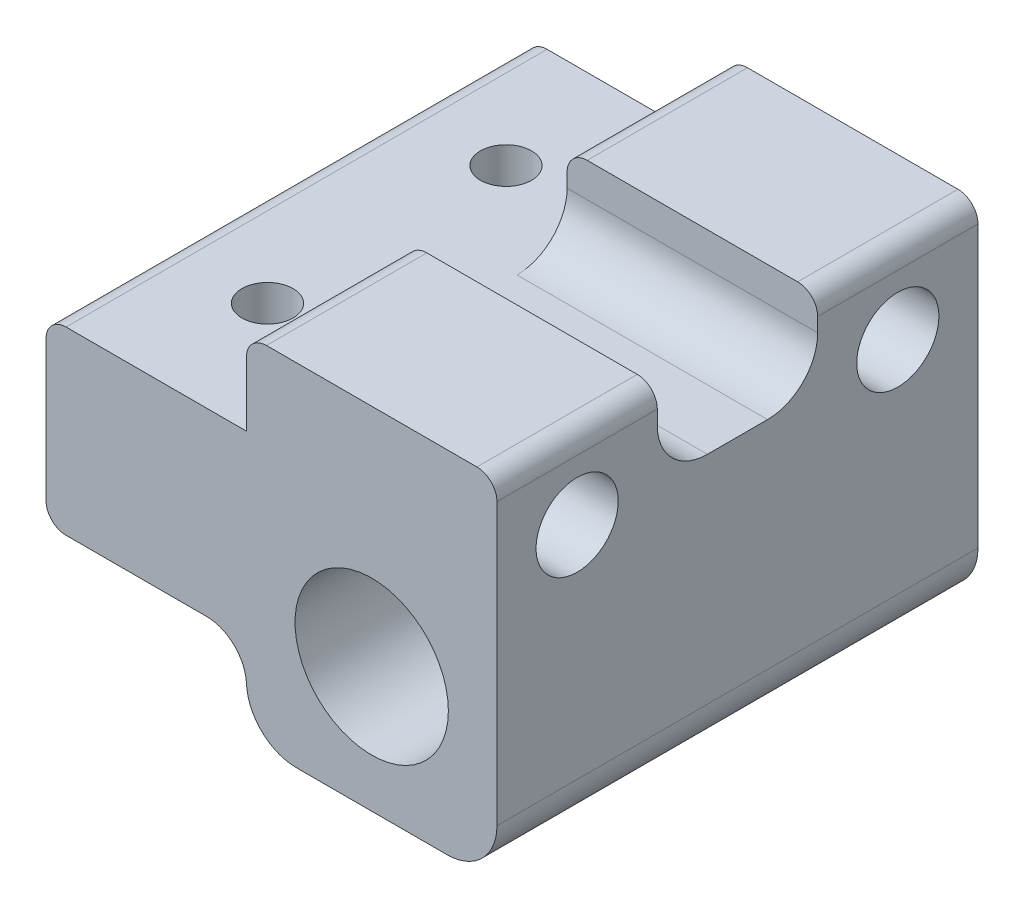
ISO-10303-21;
HEADER;
FILE_DESCRIPTION(('STEP AP214'),'2;1');
FILE_NAME('part.step','',(''),(''),'','','');
FILE_SCHEMA(('AUTOMOTIVE_DESIGN { 1 0 10303 214 1 1 1 1 }'));
ENDSEC;
DATA;
#1=APPLICATION_CONTEXT('core data for automotive mechanical design processes');
#2=APPLICATION_PROTOCOL_DEFINITION('international standard','automotive_design',2000,#1);
#3=PRODUCT_CONTEXT('',#1,'mechanical');
#4=PRODUCT('Part','Part','',(#3));
#5=PRODUCT_RELATED_PRODUCT_CATEGORY('part','',(#4));
#6=PRODUCT_DEFINITION_FORMATION('','',#4);
#7=PRODUCT_DEFINITION_CONTEXT('part definition',#1,'design');
#8=PRODUCT_DEFINITION('design','',#6,#7);
#9=PRODUCT_DEFINITION_SHAPE('','',#8);
#10=(LENGTH_UNIT() NAMED_UNIT(*) SI_UNIT(.MILLI.,.METRE.));
#11=(NAMED_UNIT(*) PLANE_ANGLE_UNIT() SI_UNIT($,.RADIAN.));
#12=(NAMED_UNIT(*) SI_UNIT($,.STERADIAN.) SOLID_ANGLE_UNIT());
#13=UNCERTAINTY_MEASURE_WITH_UNIT(LENGTH_MEASURE(1.E-05),#10,'distance_accuracy_value','');
#14=(GEOMETRIC_REPRESENTATION_CONTEXT(3) GLOBAL_UNCERTAINTY_ASSIGNED_CONTEXT((#13)) GLOBAL_UNIT_ASSIGNED_CONTEXT((#10,
#11,#12)) REPRESENTATION_CONTEXT('',''));
#15=CARTESIAN_POINT('',(0.,0.,0.));
#16=DIRECTION('',(0.,0.,1.));
#17=DIRECTION('',(1.,0.,0.));
#18=AXIS2_PLACEMENT_3D('',#15,#16,#17);
#19=CARTESIAN_POINT('',(-16.4829268292683,25.,-29.6487804878049));
#20=DIRECTION('',(1.,0.,0.));
#21=DIRECTION('',(0.,0.,-1.));
#22=AXIS2_PLACEMENT_3D('',#19,#20,#21);
#23=PLANE('',#22);
#24=DIRECTION('',(0.,-1.,0.));
#25=VECTOR('',#24,1.);
#26=CARTESIAN_POINT('',(-16.4829268292683,25.,18.3512195121952));
#27=LINE('',#26,#25);
#28=CARTESIAN_POINT('',(-16.4829268292683,33.,18.3512195121952));
#29=VERTEX_POINT('',#28);
#30=CARTESIAN_POINT('',(-16.4829268292683,26.5936932147923,18.3512195121952));
#31=VERTEX_POINT('',#30);
#32=EDGE_CURVE('E299',#29,#31,#27,.T.);
#33=ORIENTED_EDGE('',*,*,#32,.F.);
#34=DIRECTION('',(0.,0.,1.));
#35=VECTOR('',#34,1.);
#36=CARTESIAN_POINT('',(-16.4829268292683,33.,2.35121951219515));
#37=LINE('',#36,#35);
#38=CARTESIAN_POINT('',(-16.4829268292683,33.,2.35121951219515));
#39=VERTEX_POINT('',#38);
#40=EDGE_CURVE('E63',#29,#39,#37,.F.);
#41=ORIENTED_EDGE('',*,*,#40,.T.);
#42=DIRECTION('',(0.,1.,0.));
#43=VECTOR('',#42,1.);
#44=CARTESIAN_POINT('',(-16.4829268292683,-3.08795094451934,2.35121951219515));
#45=LINE('',#44,#43);
#46=CARTESIAN_POINT('',(-16.4829268292683,31.5936932147923,2.35121951219515));
#47=VERTEX_POINT('',#46);
#48=EDGE_CURVE('E481',#47,#39,#45,.T.);
#49=ORIENTED_EDGE('',*,*,#48,.F.);
#50=CARTESIAN_POINT('',(-16.4829268292683,31.5936932147923,-2.64878048780485));
#51=DIRECTION('',(1.,0.,0.));
#52=DIRECTION('',(0.,0.,-1.));
#53=AXIS2_PLACEMENT_3D('',#50,#51,#52);
#54=CIRCLE('',#53,5.);
#55=CARTESIAN_POINT('',(-16.4829268292683,26.5936932147923,-2.64878048780485));
#56=VERTEX_POINT('',#55);
#57=EDGE_CURVE('E216',#47,#56,#54,.T.);
#58=ORIENTED_EDGE('',*,*,#57,.T.);
#59=DIRECTION('',(0.,0.,-1.));
#60=VECTOR('',#59,1.);
#61=CARTESIAN_POINT('',(-16.4829268292683,26.5936932147923,18.3512195121952));
#62=LINE('',#61,#60);
#63=CARTESIAN_POINT('',(-16.4829268292683,26.5936932147923,6.27140152651317));
#64=VERTEX_POINT('',#63);
#65=EDGE_CURVE('E214',#64,#56,#62,.T.);
#66=ORIENTED_EDGE('',*,*,#65,.F.);
#67=CARTESIAN_POINT('',(-16.4829268292683,27.,10.3512195121951));
#68=DIRECTION('',(1.,0.,0.));
#69=DIRECTION('',(0.,0.,-1.));
#70=AXIS2_PLACEMENT_3D('',#67,#68,#69);
#71=CIRCLE('',#70,4.1);
#72=CARTESIAN_POINT('',(-16.4829268292683,26.5936932147923,14.4310374978771));
#73=VERTEX_POINT('',#72);
#74=EDGE_CURVE('E202',#64,#73,#71,.T.);
#75=ORIENTED_EDGE('',*,*,#74,.T.);
#76=EDGE_CURVE('E234',#31,#73,#62,.T.);
#77=ORIENTED_EDGE('',*,*,#76,.F.);
#78=EDGE_LOOP('',(#33,#41,#49,#58,#66,#75,#77));
#79=FACE_BOUND('',#78,.T.);
#80=ADVANCED_FACE('F39',(#79),#23,.F.);
#81=CARTESIAN_POINT('',(0.,35.,0.));
#82=DIRECTION('',(0.,1.,0.));
#83=DIRECTION('',(0.,0.,1.));
#84=AXIS2_PLACEMENT_3D('',#81,#82,#83);
#85=PLANE('',#84);
#86=DIRECTION('',(1.,0.,0.));
#87=VECTOR('',#86,1.);
#88=CARTESIAN_POINT('',(-16.4829268292683,35.,2.35121951219515));
#89=LINE('',#88,#87);
#90=CARTESIAN_POINT('',(-14.4829268292683,35.,2.35121951219515));
#91=VERTEX_POINT('',#90);
#92=CARTESIAN_POINT('',(6.51707317073171,35.,2.35121951219515));
#93=VERTEX_POINT('',#92);
#94=EDGE_CURVE('E470',#91,#93,#89,.T.);
#95=ORIENTED_EDGE('',*,*,#94,.F.);
#96=DIRECTION('',(0.,0.,1.));
#97=VECTOR('',#96,1.);
#98=CARTESIAN_POINT('',(-14.4829268292683,35.,18.3512195121952));
#99=LINE('',#98,#97);
#100=CARTESIAN_POINT('',(-14.4829268292683,35.,18.3512195121952));
#101=VERTEX_POINT('',#100);
#102=EDGE_CURVE('E417',#91,#101,#99,.T.);
#103=ORIENTED_EDGE('',*,*,#102,.T.);
#104=DIRECTION('',(1.,0.,0.));
#105=VECTOR('',#104,1.);
#106=CARTESIAN_POINT('',(-16.4829268292683,35.,18.3512195121952));
#107=LINE('',#106,#105);
#108=CARTESIAN_POINT('',(6.51707317073171,35.,18.3512195121952));
#109=VERTEX_POINT('',#108);
#110=EDGE_CURVE('E270',#101,#109,#107,.T.);
#111=ORIENTED_EDGE('',*,*,#110,.T.);
#112=DIRECTION('',(0.,0.,-1.));
#113=VECTOR('',#112,1.);
#114=CARTESIAN_POINT('',(6.51707317073171,35.,2.35121951219515));
#115=LINE('',#114,#113);
#116=EDGE_CURVE('E413',#109,#93,#115,.T.);
#117=ORIENTED_EDGE('',*,*,#116,.T.);
#118=EDGE_LOOP('',(#95,#103,#111,#117));
#119=FACE_BOUND('',#118,.T.);
#120=ADVANCED_FACE('F549',(#119),#85,.T.);
#121=DIRECTION('',(0.,1.,0.));
#122=VECTOR('',#121,1.);
#123=CARTESIAN_POINT('',(-16.4829268292683,-3.08795094451934,-13.6487804878049));
#124=LINE('',#123,#122);
#125=CARTESIAN_POINT('',(-16.4829268292683,31.5936932147923,-13.6487804878049));
#126=VERTEX_POINT('',#125);
#127=CARTESIAN_POINT('',(-16.4829268292683,33.,-13.6487804878049));
#128=VERTEX_POINT('',#127);
#129=EDGE_CURVE('E451',#126,#128,#124,.T.);
#130=ORIENTED_EDGE('',*,*,#129,.T.);
#131=DIRECTION('',(0.,0.,1.));
#132=VECTOR('',#131,1.);
#133=CARTESIAN_POINT('',(-16.4829268292683,33.,-29.6487804878049));
#134=LINE('',#133,#132);
#135=CARTESIAN_POINT('',(-16.4829268292683,33.,-29.6487804878049));
#136=VERTEX_POINT('',#135);
#137=EDGE_CURVE('E404',#128,#136,#134,.F.);
#138=ORIENTED_EDGE('',*,*,#137,.T.);
#139=DIRECTION('',(0.,-1.,0.));
#140=VECTOR('',#139,1.);
#141=CARTESIAN_POINT('',(-16.4829268292683,25.,-29.6487804878049));
#142=LINE('',#141,#140);
#143=CARTESIAN_POINT('',(-16.4829268292683,26.5936932147923,-29.6487804878049));
#144=VERTEX_POINT('',#143);
#145=EDGE_CURVE('E290',#136,#144,#142,.T.);
#146=ORIENTED_EDGE('',*,*,#145,.T.);
#147=CARTESIAN_POINT('',(-16.4829268292683,26.5936932147923,-25.7285984734868));
#148=VERTEX_POINT('',#147);
#149=EDGE_CURVE('E500',#148,#144,#62,.T.);
#150=ORIENTED_EDGE('',*,*,#149,.F.);
#151=CARTESIAN_POINT('',(-16.4829268292683,27.,-21.6487804878049));
#152=DIRECTION('',(1.,0.,0.));
#153=DIRECTION('',(0.,0.,-1.));
#154=AXIS2_PLACEMENT_3D('',#151,#152,#153);
#155=CIRCLE('',#154,4.1);
#156=CARTESIAN_POINT('',(-16.4829268292683,26.5936932147923,-17.5689625021229));
#157=VERTEX_POINT('',#156);
#158=EDGE_CURVE('E263',#148,#157,#155,.T.);
#159=ORIENTED_EDGE('',*,*,#158,.T.);
#160=CARTESIAN_POINT('',(-16.4829268292683,26.5936932147923,-8.64878048780485));
#161=VERTEX_POINT('',#160);
#162=EDGE_CURVE('E223',#161,#157,#62,.T.);
#163=ORIENTED_EDGE('',*,*,#162,.F.);
#164=CARTESIAN_POINT('',(-16.4829268292683,31.5936932147923,-8.64878048780485));
#165=DIRECTION('',(1.,0.,0.));
#166=DIRECTION('',(0.,0.,-1.));
#167=AXIS2_PLACEMENT_3D('',#164,#165,#166);
#168=CIRCLE('',#167,5.);
#169=EDGE_CURVE('E358',#161,#126,#168,.T.);
#170=ORIENTED_EDGE('',*,*,#169,.T.);
#171=EDGE_LOOP('',(#130,#138,#146,#150,#159,#163,#170));
#172=FACE_BOUND('',#171,.T.);
#173=ADVANCED_FACE('F529',(#172),#23,.F.);
#174=CARTESIAN_POINT('',(-16.4829268292683,25.,18.3512195121952));
#175=DIRECTION('',(0.,0.,-1.));
#176=DIRECTION('',(-1.,0.,0.));
#177=AXIS2_PLACEMENT_3D('',#174,#175,#176);
#178=PLANE('',#177);
#179=CARTESIAN_POINT('',(-3.98292682926829,12.5,18.3512195121952));
#180=DIRECTION('',(0.,0.,1.));
#181=DIRECTION('',(1.,0.,0.));
#182=AXIS2_PLACEMENT_3D('',#179,#180,#181);
#183=CIRCLE('',#182,7.65);
#184=CARTESIAN_POINT('',(3.66707317073171,12.5,18.3512195121952));
#185=VERTEX_POINT('',#184);
#186=EDGE_CURVE('E274',#185,#185,#183,.T.);
#187=ORIENTED_EDGE('',*,*,#186,.F.);
#188=EDGE_LOOP('',(#187));
#189=FACE_BOUND('',#188,.T.);
#190=ORIENTED_EDGE('',*,*,#110,.F.);
#191=CARTESIAN_POINT('',(-14.4829268292683,33.,18.3512195121952));
#192=DIRECTION('',(0.,0.,-1.));
#193=DIRECTION('',(-1.,0.,0.));
#194=AXIS2_PLACEMENT_3D('',#191,#192,#193);
#195=CIRCLE('',#194,2.);
#196=EDGE_CURVE('E424',#101,#29,#195,.F.);
#197=ORIENTED_EDGE('',*,*,#196,.T.);
#198=ORIENTED_EDGE('',*,*,#32,.T.);
#199=DIRECTION('',(1.,0.,0.));
#200=VECTOR('',#199,1.);
#201=CARTESIAN_POINT('',(-36.4829268292683,26.5936932147923,18.3512195121952));
#202=LINE('',#201,#200);
#203=CARTESIAN_POINT('',(-34.4829268292683,26.5936932147923,18.3512195121952));
#204=VERTEX_POINT('',#203);
#205=EDGE_CURVE('E242',#204,#31,#202,.T.);
#206=ORIENTED_EDGE('',*,*,#205,.F.);
#207=CARTESIAN_POINT('',(-34.4829268292683,24.5936932147923,18.3512195121952));
#208=DIRECTION('',(0.,0.,-1.));
#209=DIRECTION('',(-1.,0.,0.));
#210=AXIS2_PLACEMENT_3D('',#207,#208,#209);
#211=CIRCLE('',#210,2.);
#212=CARTESIAN_POINT('',(-36.4829268292683,24.5936932147923,18.3512195121952));
#213=VERTEX_POINT('',#212);
#214=EDGE_CURVE('E372',#204,#213,#211,.F.);
#215=ORIENTED_EDGE('',*,*,#214,.T.);
#216=DIRECTION('',(0.,1.,0.));
#217=VECTOR('',#216,1.);
#218=CARTESIAN_POINT('',(-36.4829268292683,8.59369321479233,18.3512195121952));
#219=LINE('',#218,#217);
#220=CARTESIAN_POINT('',(-36.4829268292683,10.5936932147923,18.3512195121952));
#221=VERTEX_POINT('',#220);
#222=EDGE_CURVE('E240',#221,#213,#219,.T.);
#223=ORIENTED_EDGE('',*,*,#222,.F.);
#224=CARTESIAN_POINT('',(-34.4829268292683,10.5936932147923,18.3512195121952));
#225=DIRECTION('',(0.,0.,-1.));
#226=DIRECTION('',(-1.,0.,0.));
#227=AXIS2_PLACEMENT_3D('',#224,#225,#226);
#228=CIRCLE('',#227,2.);
#229=CARTESIAN_POINT('',(-34.4829268292683,8.59369321479233,18.3512195121952));
#230=VERTEX_POINT('',#229);
#231=EDGE_CURVE('E375',#221,#230,#228,.F.);
#232=ORIENTED_EDGE('',*,*,#231,.T.);
#233=DIRECTION('',(1.,0.,0.));
#234=VECTOR('',#233,1.);
#235=CARTESIAN_POINT('',(-36.4829268292683,8.59369321479233,18.3512195121952));
#236=LINE('',#235,#234);
#237=CARTESIAN_POINT('',(-20.473750751262,8.59369321479233,18.3512195121952));
#238=VERTEX_POINT('',#237);
#239=EDGE_CURVE('E245',#230,#238,#236,.T.);
#240=ORIENTED_EDGE('',*,*,#239,.T.);
#241=CARTESIAN_POINT('',(-20.473750751262,4.59369321479233,18.3512195121952));
#242=DIRECTION('',(0.,0.,-1.));
#243=DIRECTION('',(-1.,0.,0.));
#244=AXIS2_PLACEMENT_3D('',#241,#242,#243);
#245=CIRCLE('',#244,4.);
#246=CARTESIAN_POINT('',(-16.4778290081537,4.77427400821796,18.3512195121952));
#247=VERTEX_POINT('',#246);
#248=EDGE_CURVE('E333',#238,#247,#245,.T.);
#249=ORIENTED_EDGE('',*,*,#248,.T.);
#250=CARTESIAN_POINT('',(-11.4829268292683,5.,18.3512195121952));
#251=DIRECTION('',(0.,0.,-1.));
#252=DIRECTION('',(-1.,0.,0.));
#253=AXIS2_PLACEMENT_3D('',#250,#251,#252);
#254=CIRCLE('',#253,5.);
#255=CARTESIAN_POINT('',(-11.4829268292683,0.,18.3512195121952));
#256=VERTEX_POINT('',#255);
#257=EDGE_CURVE('E306',#247,#256,#254,.F.);
#258=ORIENTED_EDGE('',*,*,#257,.T.);
#259=DIRECTION('',(1.,0.,0.));
#260=VECTOR('',#259,1.);
#261=CARTESIAN_POINT('',(-16.4829268292683,0.,18.3512195121952));
#262=LINE('',#261,#260);
#263=CARTESIAN_POINT('',(3.51707317073171,0.,18.3512195121952));
#264=VERTEX_POINT('',#263);
#265=EDGE_CURVE('E279',#256,#264,#262,.T.);
#266=ORIENTED_EDGE('',*,*,#265,.T.);
#267=CARTESIAN_POINT('',(3.51707317073171,5.,18.3512195121952));
#268=DIRECTION('',(0.,0.,-1.));
#269=DIRECTION('',(-1.,0.,0.));
#270=AXIS2_PLACEMENT_3D('',#267,#268,#269);
#271=CIRCLE('',#270,5.);
#272=CARTESIAN_POINT('',(8.51707317073171,5.,18.3512195121952));
#273=VERTEX_POINT('',#272);
#274=EDGE_CURVE('E302',#264,#273,#271,.F.);
#275=ORIENTED_EDGE('',*,*,#274,.T.);
#276=DIRECTION('',(0.,-1.,0.));
#277=VECTOR('',#276,1.);
#278=CARTESIAN_POINT('',(8.51707317073171,25.,18.3512195121952));
#279=LINE('',#278,#277);
#280=CARTESIAN_POINT('',(8.51707317073171,33.,18.3512195121952));
#281=VERTEX_POINT('',#280);
#282=EDGE_CURVE('E296',#281,#273,#279,.T.);
#283=ORIENTED_EDGE('',*,*,#282,.F.);
#284=CARTESIAN_POINT('',(6.51707317073171,33.,18.3512195121952));
#285=DIRECTION('',(0.,0.,-1.));
#286=DIRECTION('',(-1.,0.,0.));
#287=AXIS2_PLACEMENT_3D('',#284,#285,#286);
#288=CIRCLE('',#287,2.);
#289=EDGE_CURVE('E421',#281,#109,#288,.F.);
#290=ORIENTED_EDGE('',*,*,#289,.T.);
#291=EDGE_LOOP('',(#190,#197,#198,#206,#215,#223,#232,#240,#249,#258,#266,#275,#283,#290));
#292=FACE_BOUND('',#291,.T.);
#293=ADVANCED_FACE('F559',(#189,#292),#178,.F.);
#294=CARTESIAN_POINT('',(8.5170731707317,25.,-29.6487804878049));
#295=DIRECTION('',(-1.,0.,0.));
#296=DIRECTION('',(0.,0.,1.));
#297=AXIS2_PLACEMENT_3D('',#294,#295,#296);
#298=PLANE('',#297);
#299=CARTESIAN_POINT('',(8.51707317073171,27.,10.3512195121951));
#300=DIRECTION('',(1.,0.,0.));
#301=DIRECTION('',(0.,0.,-1.));
#302=AXIS2_PLACEMENT_3D('',#299,#300,#301);
#303=CIRCLE('',#302,4.1);
#304=CARTESIAN_POINT('',(8.51707317073171,27.,6.25121951219515));
#305=VERTEX_POINT('',#304);
#306=EDGE_CURVE('E211',#305,#305,#303,.T.);
#307=ORIENTED_EDGE('',*,*,#306,.F.);
#308=EDGE_LOOP('',(#307));
#309=FACE_BOUND('',#308,.T.);
#310=CARTESIAN_POINT('',(8.51707317073171,27.,-21.6487804878049));
#311=DIRECTION('',(1.,0.,0.));
#312=DIRECTION('',(0.,0.,-1.));
#313=AXIS2_PLACEMENT_3D('',#310,#311,#312);
#314=CIRCLE('',#313,4.1);
#315=CARTESIAN_POINT('',(8.51707317073171,27.,-25.7487804878049));
#316=VERTEX_POINT('',#315);
#317=EDGE_CURVE('E254',#316,#316,#314,.T.);
#318=ORIENTED_EDGE('',*,*,#317,.F.);
#319=EDGE_LOOP('',(#318));
#320=FACE_BOUND('',#319,.T.);
#321=DIRECTION('',(0.,1.,0.));
#322=VECTOR('',#321,1.);
#323=CARTESIAN_POINT('',(8.51707317073171,-3.08795094451934,2.35121951219515));
#324=LINE('',#323,#322);
#325=CARTESIAN_POINT('',(8.51707317073171,31.5936932147923,2.35121951219515));
#326=VERTEX_POINT('',#325);
#327=CARTESIAN_POINT('',(8.51707317073171,33.,2.35121951219515));
#328=VERTEX_POINT('',#327);
#329=EDGE_CURVE('E469',#326,#328,#324,.T.);
#330=ORIENTED_EDGE('',*,*,#329,.T.);
#331=DIRECTION('',(0.,0.,-1.));
#332=VECTOR('',#331,1.);
#333=CARTESIAN_POINT('',(8.51707317073171,33.,18.3512195121952));
#334=LINE('',#333,#332);
#335=EDGE_CURVE('E11',#328,#281,#334,.F.);
#336=ORIENTED_EDGE('',*,*,#335,.T.);
#337=ORIENTED_EDGE('',*,*,#282,.T.);
#338=DIRECTION('',(0.,0.,-1.));
#339=VECTOR('',#338,1.);
#340=CARTESIAN_POINT('',(8.5170731707317,5.,-29.6487804878049));
#341=LINE('',#340,#339);
#342=CARTESIAN_POINT('',(8.5170731707317,5.,-29.6487804878049));
#343=VERTEX_POINT('',#342);
#344=EDGE_CURVE('E322',#273,#343,#341,.T.);
#345=ORIENTED_EDGE('',*,*,#344,.T.);
#346=DIRECTION('',(0.,-1.,0.));
#347=VECTOR('',#346,1.);
#348=CARTESIAN_POINT('',(8.5170731707317,25.,-29.6487804878049));
#349=LINE('',#348,#347);
#350=CARTESIAN_POINT('',(8.5170731707317,33.,-29.6487804878049));
#351=VERTEX_POINT('',#350);
#352=EDGE_CURVE('E293',#351,#343,#349,.T.);
#353=ORIENTED_EDGE('',*,*,#352,.F.);
#354=DIRECTION('',(0.,0.,-1.));
#355=VECTOR('',#354,1.);
#356=CARTESIAN_POINT('',(8.51707317073171,33.,-13.6487804878049));
#357=LINE('',#356,#355);
#358=CARTESIAN_POINT('',(8.51707317073171,33.,-13.6487804878049));
#359=VERTEX_POINT('',#358);
#360=EDGE_CURVE('E48',#351,#359,#357,.F.);
#361=ORIENTED_EDGE('',*,*,#360,.T.);
#362=DIRECTION('',(0.,1.,0.));
#363=VECTOR('',#362,1.);
#364=CARTESIAN_POINT('',(8.51707317073171,-3.08795094451934,-13.6487804878049));
#365=LINE('',#364,#363);
#366=CARTESIAN_POINT('',(8.51707317073171,31.5936932147923,-13.6487804878049));
#367=VERTEX_POINT('',#366);
#368=EDGE_CURVE('E440',#367,#359,#365,.T.);
#369=ORIENTED_EDGE('',*,*,#368,.F.);
#370=CARTESIAN_POINT('',(8.51707317073171,31.5936932147923,-8.64878048780485));
#371=DIRECTION('',(-1.,0.,0.));
#372=DIRECTION('',(0.,0.,1.));
#373=AXIS2_PLACEMENT_3D('',#370,#371,#372);
#374=CIRCLE('',#373,5.);
#375=CARTESIAN_POINT('',(8.51707317073171,26.5936932147923,-8.64878048780485));
#376=VERTEX_POINT('',#375);
#377=EDGE_CURVE('E361',#367,#376,#374,.T.);
#378=ORIENTED_EDGE('',*,*,#377,.T.);
#379=DIRECTION('',(0.,0.,-1.));
#380=VECTOR('',#379,1.);
#381=CARTESIAN_POINT('',(8.51707317073171,26.5936932147923,-13.6487804878049));
#382=LINE('',#381,#380);
#383=CARTESIAN_POINT('',(8.51707317073171,26.5936932147923,-2.64878048780485));
#384=VERTEX_POINT('',#383);
#385=EDGE_CURVE('E452',#384,#376,#382,.T.);
#386=ORIENTED_EDGE('',*,*,#385,.F.);
#387=CARTESIAN_POINT('',(8.51707317073171,31.5936932147923,-2.64878048780485));
#388=DIRECTION('',(-1.,0.,0.));
#389=DIRECTION('',(0.,0.,1.));
#390=AXIS2_PLACEMENT_3D('',#387,#388,#389);
#391=CIRCLE('',#390,5.);
#392=EDGE_CURVE('E353',#384,#326,#391,.T.);
#393=ORIENTED_EDGE('',*,*,#392,.T.);
#394=EDGE_LOOP('',(#330,#336,#337,#345,#353,#361,#369,#378,#386,#393));
#395=FACE_BOUND('',#394,.T.);
#396=ADVANCED_FACE('F439',(#309,#320,#395),#298,.F.);
#397=CARTESIAN_POINT('',(-16.4829268292683,25.,-29.6487804878049));
#398=DIRECTION('',(0.,0.,1.));
#399=DIRECTION('',(1.,0.,0.));
#400=AXIS2_PLACEMENT_3D('',#397,#398,#399);
#401=PLANE('',#400);
#402=CARTESIAN_POINT('',(-3.98292682926829,12.5,-29.6487804878049));
#403=DIRECTION('',(0.,0.,1.));
#404=DIRECTION('',(1.,0.,0.));
#405=AXIS2_PLACEMENT_3D('',#402,#403,#404);
#406=CIRCLE('',#405,7.65);
#407=CARTESIAN_POINT('',(3.66707317073171,12.5,-29.6487804878049));
#408=VERTEX_POINT('',#407);
#409=EDGE_CURVE('E275',#408,#408,#406,.T.);
#410=ORIENTED_EDGE('',*,*,#409,.T.);
#411=EDGE_LOOP('',(#410));
#412=FACE_BOUND('',#411,.T.);
#413=ORIENTED_EDGE('',*,*,#145,.F.);
#414=CARTESIAN_POINT('',(-14.4829268292683,33.,-29.6487804878049));
#415=DIRECTION('',(0.,0.,1.));
#416=DIRECTION('',(1.,0.,0.));
#417=AXIS2_PLACEMENT_3D('',#414,#415,#416);
#418=CIRCLE('',#417,2.);
#419=CARTESIAN_POINT('',(-14.4829268292683,35.,-29.6487804878049));
#420=VERTEX_POINT('',#419);
#421=EDGE_CURVE('E410',#136,#420,#418,.F.);
#422=ORIENTED_EDGE('',*,*,#421,.T.);
#423=DIRECTION('',(-1.,0.,0.));
#424=VECTOR('',#423,1.);
#425=CARTESIAN_POINT('',(8.5170731707317,35.,-29.6487804878049));
#426=LINE('',#425,#424);
#427=CARTESIAN_POINT('',(6.51707317073171,35.,-29.6487804878049));
#428=VERTEX_POINT('',#427);
#429=EDGE_CURVE('E230',#428,#420,#426,.T.);
#430=ORIENTED_EDGE('',*,*,#429,.F.);
#431=CARTESIAN_POINT('',(6.51707317073171,33.,-29.6487804878049));
#432=DIRECTION('',(0.,0.,1.));
#433=DIRECTION('',(1.,0.,0.));
#434=AXIS2_PLACEMENT_3D('',#431,#432,#433);
#435=CIRCLE('',#434,2.);
#436=EDGE_CURVE('E407',#428,#351,#435,.F.);
#437=ORIENTED_EDGE('',*,*,#436,.T.);
#438=ORIENTED_EDGE('',*,*,#352,.T.);
#439=CARTESIAN_POINT('',(3.5170731707317,5.,-29.6487804878049));
#440=DIRECTION('',(0.,0.,1.));
#441=DIRECTION('',(1.,0.,0.));
#442=AXIS2_PLACEMENT_3D('',#439,#440,#441);
#443=CIRCLE('',#442,5.);
#444=CARTESIAN_POINT('',(3.51707317073171,0.,-29.6487804878049));
#445=VERTEX_POINT('',#444);
#446=EDGE_CURVE('E315',#343,#445,#443,.F.);
#447=ORIENTED_EDGE('',*,*,#446,.T.);
#448=DIRECTION('',(-1.,0.,0.));
#449=VECTOR('',#448,1.);
#450=CARTESIAN_POINT('',(-16.4829268292683,0.,-29.6487804878049));
#451=LINE('',#450,#449);
#452=CARTESIAN_POINT('',(-11.4829268292683,0.,-29.6487804878049));
#453=VERTEX_POINT('',#452);
#454=EDGE_CURVE('E286',#445,#453,#451,.T.);
#455=ORIENTED_EDGE('',*,*,#454,.T.);
#456=CARTESIAN_POINT('',(-11.4829268292683,5.,-29.6487804878049));
#457=DIRECTION('',(0.,0.,1.));
#458=DIRECTION('',(1.,0.,0.));
#459=AXIS2_PLACEMENT_3D('',#456,#457,#458);
#460=CIRCLE('',#459,5.);
#461=CARTESIAN_POINT('',(-16.4778290081537,4.77427400821796,-29.6487804878049));
#462=VERTEX_POINT('',#461);
#463=EDGE_CURVE('E318',#453,#462,#460,.F.);
#464=ORIENTED_EDGE('',*,*,#463,.T.);
#465=CARTESIAN_POINT('',(-20.473750751262,4.59369321479233,-29.6487804878049));
#466=DIRECTION('',(0.,0.,1.));
#467=DIRECTION('',(1.,0.,0.));
#468=AXIS2_PLACEMENT_3D('',#465,#466,#467);
#469=CIRCLE('',#468,4.);
#470=CARTESIAN_POINT('',(-20.473750751262,8.59369321479233,-29.6487804878049));
#471=VERTEX_POINT('',#470);
#472=EDGE_CURVE('E336',#462,#471,#469,.T.);
#473=ORIENTED_EDGE('',*,*,#472,.T.);
#474=DIRECTION('',(1.,0.,0.));
#475=VECTOR('',#474,1.);
#476=CARTESIAN_POINT('',(-36.4829268292683,8.59369321479233,-29.6487804878049));
#477=LINE('',#476,#475);
#478=CARTESIAN_POINT('',(-34.4829268292683,8.59369321479233,-29.6487804878049));
#479=VERTEX_POINT('',#478);
#480=EDGE_CURVE('E248',#479,#471,#477,.T.);
#481=ORIENTED_EDGE('',*,*,#480,.F.);
#482=CARTESIAN_POINT('',(-34.4829268292683,10.5936932147923,-29.6487804878049));
#483=DIRECTION('',(0.,0.,1.));
#484=DIRECTION('',(1.,0.,0.));
#485=AXIS2_PLACEMENT_3D('',#482,#483,#484);
#486=CIRCLE('',#485,2.);
#487=CARTESIAN_POINT('',(-36.4829268292683,10.5936932147923,-29.6487804878049));
#488=VERTEX_POINT('',#487);
#489=EDGE_CURVE('E384',#479,#488,#486,.F.);
#490=ORIENTED_EDGE('',*,*,#489,.T.);
#491=DIRECTION('',(0.,-1.,0.));
#492=VECTOR('',#491,1.);
#493=CARTESIAN_POINT('',(-36.4829268292683,26.5936932147923,-29.6487804878049));
#494=LINE('',#493,#492);
#495=CARTESIAN_POINT('',(-36.4829268292683,24.5936932147923,-29.6487804878049));
#496=VERTEX_POINT('',#495);
#497=EDGE_CURVE('E237',#496,#488,#494,.T.);
#498=ORIENTED_EDGE('',*,*,#497,.F.);
#499=CARTESIAN_POINT('',(-34.4829268292683,24.5936932147923,-29.6487804878049));
#500=DIRECTION('',(0.,0.,1.));
#501=DIRECTION('',(1.,0.,0.));
#502=AXIS2_PLACEMENT_3D('',#499,#500,#501);
#503=CIRCLE('',#502,2.);
#504=CARTESIAN_POINT('',(-34.4829268292683,26.5936932147923,-29.6487804878049));
#505=VERTEX_POINT('',#504);
#506=EDGE_CURVE('E381',#496,#505,#503,.F.);
#507=ORIENTED_EDGE('',*,*,#506,.T.);
#508=DIRECTION('',(1.,0.,0.));
#509=VECTOR('',#508,1.);
#510=CARTESIAN_POINT('',(-36.4829268292683,26.5936932147923,-29.6487804878049));
#511=LINE('',#510,#509);
#512=EDGE_CURVE('E251',#505,#144,#511,.T.);
#513=ORIENTED_EDGE('',*,*,#512,.T.);
#514=EDGE_LOOP('',(#413,#422,#430,#437,#438,#447,#455,#464,#473,#481,#490,#498,#507,#513));
#515=FACE_BOUND('',#514,.T.);
#516=ADVANCED_FACE('F462',(#412,#515),#401,.F.);
#517=CARTESIAN_POINT('',(0.,0.,0.));
#518=DIRECTION('',(0.,1.,0.));
#519=DIRECTION('',(0.,0.,1.));
#520=AXIS2_PLACEMENT_3D('',#517,#518,#519);
#521=PLANE('',#520);
#522=ORIENTED_EDGE('',*,*,#265,.F.);
#523=DIRECTION('',(0.,0.,1.));
#524=VECTOR('',#523,1.);
#525=CARTESIAN_POINT('',(-11.4829268292683,0.,0.));
#526=LINE('',#525,#524);
#527=EDGE_CURVE('E312',#256,#453,#526,.F.);
#528=ORIENTED_EDGE('',*,*,#527,.T.);
#529=ORIENTED_EDGE('',*,*,#454,.F.);
#530=DIRECTION('',(0.,0.,-1.));
#531=VECTOR('',#530,1.);
#532=CARTESIAN_POINT('',(3.51707317073171,0.,0.));
#533=LINE('',#532,#531);
#534=EDGE_CURVE('E309',#445,#264,#533,.F.);
#535=ORIENTED_EDGE('',*,*,#534,.T.);
#536=EDGE_LOOP('',(#522,#528,#529,#535));
#537=FACE_BOUND('',#536,.T.);
#538=ADVANCED_FACE('F573',(#537),#521,.F.);
#539=CARTESIAN_POINT('',(-3.98292682926829,12.5,-29.6487804878049));
#540=DIRECTION('',(0.,0.,1.));
#541=DIRECTION('',(1.,0.,0.));
#542=AXIS2_PLACEMENT_3D('',#539,#540,#541);
#543=CYLINDRICAL_SURFACE('',#542,7.65);
#544=ORIENTED_EDGE('',*,*,#409,.F.);
#545=EDGE_LOOP('',(#544));
#546=FACE_BOUND('',#545,.T.);
#547=ORIENTED_EDGE('',*,*,#186,.T.);
#548=EDGE_LOOP('',(#547));
#549=FACE_BOUND('',#548,.T.);
#550=ADVANCED_FACE('F577',(#546,#549),#543,.F.);
#551=ORIENTED_EDGE('',*,*,#429,.T.);
#552=DIRECTION('',(0.,0.,1.));
#553=VECTOR('',#552,1.);
#554=CARTESIAN_POINT('',(-14.4829268292683,35.,-13.6487804878049));
#555=LINE('',#554,#553);
#556=CARTESIAN_POINT('',(-14.4829268292683,35.,-13.6487804878049));
#557=VERTEX_POINT('',#556);
#558=EDGE_CURVE('E394',#420,#557,#555,.T.);
#559=ORIENTED_EDGE('',*,*,#558,.T.);
#560=DIRECTION('',(-1.,0.,0.));
#561=VECTOR('',#560,1.);
#562=CARTESIAN_POINT('',(-16.4829268292683,35.,-13.6487804878049));
#563=LINE('',#562,#561);
#564=CARTESIAN_POINT('',(6.51707317073171,35.,-13.6487804878049));
#565=VERTEX_POINT('',#564);
#566=EDGE_CURVE('E459',#565,#557,#563,.T.);
#567=ORIENTED_EDGE('',*,*,#566,.F.);
#568=DIRECTION('',(0.,0.,-1.));
#569=VECTOR('',#568,1.);
#570=CARTESIAN_POINT('',(6.51707317073171,35.,-29.6487804878049));
#571=LINE('',#570,#569);
#572=EDGE_CURVE('E390',#565,#428,#571,.T.);
#573=ORIENTED_EDGE('',*,*,#572,.T.);
#574=EDGE_LOOP('',(#551,#559,#567,#573));
#575=FACE_BOUND('',#574,.T.);
#576=ADVANCED_FACE('F457',(#575),#85,.T.);
#577=CARTESIAN_POINT('',(-16.4829268292683,27.,-21.6487804878049));
#578=DIRECTION('',(1.,0.,0.));
#579=DIRECTION('',(0.,0.,-1.));
#580=AXIS2_PLACEMENT_3D('',#577,#578,#579);
#581=CYLINDRICAL_SURFACE('',#580,4.1);
#582=EDGE_CURVE('E259',#157,#148,#155,.T.);
#583=ORIENTED_EDGE('',*,*,#582,.F.);
#584=ORIENTED_EDGE('',*,*,#158,.F.);
#585=EDGE_LOOP('',(#583,#584));
#586=FACE_BOUND('',#585,.T.);
#587=ORIENTED_EDGE('',*,*,#317,.T.);
#588=EDGE_LOOP('',(#587));
#589=FACE_BOUND('',#588,.T.);
#590=ADVANCED_FACE('F532',(#586,#589),#581,.F.);
#591=CARTESIAN_POINT('',(-16.4829268292683,27.,10.3512195121951));
#592=DIRECTION('',(1.,0.,0.));
#593=DIRECTION('',(0.,0.,-1.));
#594=AXIS2_PLACEMENT_3D('',#591,#592,#593);
#595=CYLINDRICAL_SURFACE('',#594,4.1);
#596=EDGE_CURVE('E207',#73,#64,#71,.T.);
#597=ORIENTED_EDGE('',*,*,#596,.F.);
#598=ORIENTED_EDGE('',*,*,#74,.F.);
#599=EDGE_LOOP('',(#597,#598));
#600=FACE_BOUND('',#599,.T.);
#601=ORIENTED_EDGE('',*,*,#306,.T.);
#602=EDGE_LOOP('',(#601));
#603=FACE_BOUND('',#602,.T.);
#604=ADVANCED_FACE('F204',(#600,#603),#595,.F.);
#605=CARTESIAN_POINT('',(-11.4829268292683,5.,-29.6487804878049));
#606=DIRECTION('',(0.,0.,1.));
#607=DIRECTION('',(1.,0.,0.));
#608=AXIS2_PLACEMENT_3D('',#605,#606,#607);
#609=CYLINDRICAL_SURFACE('',#608,5.);
#610=ORIENTED_EDGE('',*,*,#257,.F.);
#611=DIRECTION('',(0.,0.,1.));
#612=VECTOR('',#611,1.);
#613=CARTESIAN_POINT('',(-16.4778290081537,4.77427400821796,-29.6487804878049));
#614=LINE('',#613,#612);
#615=EDGE_CURVE('E330',#247,#462,#614,.F.);
#616=ORIENTED_EDGE('',*,*,#615,.T.);
#617=ORIENTED_EDGE('',*,*,#463,.F.);
#618=ORIENTED_EDGE('',*,*,#527,.F.);
#619=EDGE_LOOP('',(#610,#616,#617,#618));
#620=FACE_BOUND('',#619,.T.);
#621=ADVANCED_FACE('F543',(#620),#609,.T.);
#622=CARTESIAN_POINT('',(3.5170731707317,5.,-29.6487804878049));
#623=DIRECTION('',(0.,0.,-1.));
#624=DIRECTION('',(-1.,0.,0.));
#625=AXIS2_PLACEMENT_3D('',#622,#623,#624);
#626=CYLINDRICAL_SURFACE('',#625,5.);
#627=ORIENTED_EDGE('',*,*,#274,.F.);
#628=ORIENTED_EDGE('',*,*,#534,.F.);
#629=ORIENTED_EDGE('',*,*,#446,.F.);
#630=ORIENTED_EDGE('',*,*,#344,.F.);
#631=EDGE_LOOP('',(#627,#628,#629,#630));
#632=FACE_BOUND('',#631,.T.);
#633=ADVANCED_FACE('F537',(#632),#626,.T.);
#634=CARTESIAN_POINT('',(-16.4829268292683,0.,0.));
#635=DIRECTION('',(-1.,0.,0.));
#636=DIRECTION('',(0.,0.,1.));
#637=AXIS2_PLACEMENT_3D('',#634,#635,#636);
#638=PLANE('',#637);
#639=EDGE_CURVE('E225',#157,#148,#62,.T.);
#640=ORIENTED_EDGE('',*,*,#639,.F.);
#641=ORIENTED_EDGE('',*,*,#582,.T.);
#642=EDGE_LOOP('',(#640,#641));
#643=FACE_BOUND('',#642,.T.);
#644=ADVANCED_FACE('F535',(#643),#638,.F.);
#645=EDGE_CURVE('E222',#73,#64,#62,.T.);
#646=ORIENTED_EDGE('',*,*,#645,.F.);
#647=ORIENTED_EDGE('',*,*,#596,.T.);
#648=EDGE_LOOP('',(#646,#647));
#649=FACE_BOUND('',#648,.T.);
#650=ADVANCED_FACE('F227',(#649),#638,.F.);
#651=CARTESIAN_POINT('',(-36.4829268292683,26.5936932147923,18.3512195121952));
#652=DIRECTION('',(0.,-1.,0.));
#653=DIRECTION('',(0.,0.,-1.));
#654=AXIS2_PLACEMENT_3D('',#651,#652,#653);
#655=PLANE('',#654);
#656=CARTESIAN_POINT('',(-26.4829268292683,26.5936932147923,6.25121951219515));
#657=DIRECTION('',(0.,-1.,0.));
#658=DIRECTION('',(0.,0.,-1.));
#659=AXIS2_PLACEMENT_3D('',#656,#657,#658);
#660=CIRCLE('',#659,2.55);
#661=CARTESIAN_POINT('',(-26.4829268292683,26.5936932147923,3.70121951219515));
#662=VERTEX_POINT('',#661);
#663=EDGE_CURVE('E497',#662,#662,#660,.T.);
#664=ORIENTED_EDGE('',*,*,#663,.T.);
#665=EDGE_LOOP('',(#664));
#666=FACE_BOUND('',#665,.T.);
#667=CARTESIAN_POINT('',(-26.4829268292683,26.5936932147923,-17.5487804878049));
#668=DIRECTION('',(0.,-1.,0.));
#669=DIRECTION('',(0.,0.,-1.));
#670=AXIS2_PLACEMENT_3D('',#667,#668,#669);
#671=CIRCLE('',#670,2.55);
#672=CARTESIAN_POINT('',(-26.4829268292683,26.5936932147923,-20.0987804878049));
#673=VERTEX_POINT('',#672);
#674=EDGE_CURVE('E490',#673,#673,#671,.T.);
#675=ORIENTED_EDGE('',*,*,#674,.T.);
#676=EDGE_LOOP('',(#675));
#677=FACE_BOUND('',#676,.T.);
#678=ORIENTED_EDGE('',*,*,#512,.F.);
#679=DIRECTION('',(0.,0.,-1.));
#680=VECTOR('',#679,1.);
#681=CARTESIAN_POINT('',(-34.4829268292683,26.5936932147923,18.3512195121952));
#682=LINE('',#681,#680);
#683=EDGE_CURVE('E387',#505,#204,#682,.F.);
#684=ORIENTED_EDGE('',*,*,#683,.T.);
#685=ORIENTED_EDGE('',*,*,#205,.T.);
#686=ORIENTED_EDGE('',*,*,#76,.T.);
#687=ORIENTED_EDGE('',*,*,#645,.T.);
#688=ORIENTED_EDGE('',*,*,#65,.T.);
#689=DIRECTION('',(1.,0.,0.));
#690=VECTOR('',#689,1.);
#691=CARTESIAN_POINT('',(8.51707317073171,26.5936932147923,-2.64878048780485));
#692=LINE('',#691,#690);
#693=EDGE_CURVE('E344',#56,#384,#692,.T.);
#694=ORIENTED_EDGE('',*,*,#693,.T.);
#695=ORIENTED_EDGE('',*,*,#385,.T.);
#696=DIRECTION('',(-1.,0.,0.));
#697=VECTOR('',#696,1.);
#698=CARTESIAN_POINT('',(-16.4829268292683,26.5936932147923,-8.64878048780485));
#699=LINE('',#698,#697);
#700=EDGE_CURVE('E340',#376,#161,#699,.T.);
#701=ORIENTED_EDGE('',*,*,#700,.T.);
#702=ORIENTED_EDGE('',*,*,#162,.T.);
#703=ORIENTED_EDGE('',*,*,#639,.T.);
#704=ORIENTED_EDGE('',*,*,#149,.T.);
#705=EDGE_LOOP('',(#678,#684,#685,#686,#687,#688,#694,#695,#701,#702,#703,#704));
#706=FACE_BOUND('',#705,.T.);
#707=ADVANCED_FACE('F232',(#666,#677,#706),#655,.F.);
#708=CARTESIAN_POINT('',(-36.4829268292683,8.59369321479233,-29.6487804878049));
#709=DIRECTION('',(0.,1.,0.));
#710=DIRECTION('',(0.,0.,1.));
#711=AXIS2_PLACEMENT_3D('',#708,#709,#710);
#712=PLANE('',#711);
#713=CARTESIAN_POINT('',(-26.4829268292683,8.59369321479233,6.25121951219515));
#714=DIRECTION('',(0.,-1.,0.));
#715=DIRECTION('',(0.,0.,-1.));
#716=AXIS2_PLACEMENT_3D('',#713,#714,#715);
#717=CIRCLE('',#716,2.55);
#718=CARTESIAN_POINT('',(-26.4829268292683,8.59369321479233,3.70121951219515));
#719=VERTEX_POINT('',#718);
#720=EDGE_CURVE('E486',#719,#719,#717,.T.);
#721=ORIENTED_EDGE('',*,*,#720,.F.);
#722=EDGE_LOOP('',(#721));
#723=FACE_BOUND('',#722,.T.);
#724=CARTESIAN_POINT('',(-26.4829268292683,8.59369321479233,-17.5487804878049));
#725=DIRECTION('',(0.,-1.,0.));
#726=DIRECTION('',(0.,0.,-1.));
#727=AXIS2_PLACEMENT_3D('',#724,#725,#726);
#728=CIRCLE('',#727,2.55);
#729=CARTESIAN_POINT('',(-26.4829268292683,8.59369321479233,-20.0987804878049));
#730=VERTEX_POINT('',#729);
#731=EDGE_CURVE('E485',#730,#730,#728,.T.);
#732=ORIENTED_EDGE('',*,*,#731,.F.);
#733=EDGE_LOOP('',(#732));
#734=FACE_BOUND('',#733,.T.);
#735=ORIENTED_EDGE('',*,*,#239,.F.);
#736=DIRECTION('',(0.,0.,1.));
#737=VECTOR('',#736,1.);
#738=CARTESIAN_POINT('',(-34.4829268292683,8.59369321479233,-29.6487804878049));
#739=LINE('',#738,#737);
#740=EDGE_CURVE('E378',#230,#479,#739,.F.);
#741=ORIENTED_EDGE('',*,*,#740,.T.);
#742=ORIENTED_EDGE('',*,*,#480,.T.);
#743=DIRECTION('',(0.,0.,1.));
#744=VECTOR('',#743,1.);
#745=CARTESIAN_POINT('',(-20.473750751262,8.59369321479233,-29.6487804878049));
#746=LINE('',#745,#744);
#747=EDGE_CURVE('E326',#471,#238,#746,.T.);
#748=ORIENTED_EDGE('',*,*,#747,.T.);
#749=EDGE_LOOP('',(#735,#741,#742,#748));
#750=FACE_BOUND('',#749,.T.);
#751=ADVANCED_FACE('F588',(#723,#734,#750),#712,.F.);
#752=CARTESIAN_POINT('',(-36.4829268292683,0.,0.));
#753=DIRECTION('',(-1.,0.,0.));
#754=DIRECTION('',(0.,0.,1.));
#755=AXIS2_PLACEMENT_3D('',#752,#753,#754);
#756=PLANE('',#755);
#757=ORIENTED_EDGE('',*,*,#497,.T.);
#758=DIRECTION('',(0.,0.,1.));
#759=VECTOR('',#758,1.);
#760=CARTESIAN_POINT('',(-36.4829268292683,10.5936932147923,18.3512195121952));
#761=LINE('',#760,#759);
#762=EDGE_CURVE('E368',#488,#221,#761,.T.);
#763=ORIENTED_EDGE('',*,*,#762,.T.);
#764=ORIENTED_EDGE('',*,*,#222,.T.);
#765=DIRECTION('',(0.,0.,-1.));
#766=VECTOR('',#765,1.);
#767=CARTESIAN_POINT('',(-36.4829268292683,24.5936932147923,-29.6487804878049));
#768=LINE('',#767,#766);
#769=EDGE_CURVE('E364',#213,#496,#768,.T.);
#770=ORIENTED_EDGE('',*,*,#769,.T.);
#771=EDGE_LOOP('',(#757,#763,#764,#770));
#772=FACE_BOUND('',#771,.T.);
#773=ADVANCED_FACE('F510',(#772),#756,.T.);
#774=CARTESIAN_POINT('',(-26.4829268292683,35.,-17.5487804878049));
#775=DIRECTION('',(0.,-1.,0.));
#776=DIRECTION('',(0.,0.,-1.));
#777=AXIS2_PLACEMENT_3D('',#774,#775,#776);
#778=CYLINDRICAL_SURFACE('',#777,2.55);
#779=ORIENTED_EDGE('',*,*,#731,.T.);
#780=EDGE_LOOP('',(#779));
#781=FACE_BOUND('',#780,.T.);
#782=ORIENTED_EDGE('',*,*,#674,.F.);
#783=EDGE_LOOP('',(#782));
#784=FACE_BOUND('',#783,.T.);
#785=ADVANCED_FACE('F595',(#781,#784),#778,.F.);
#786=CARTESIAN_POINT('',(-26.4829268292683,35.,6.25121951219515));
#787=DIRECTION('',(0.,-1.,0.));
#788=DIRECTION('',(0.,0.,-1.));
#789=AXIS2_PLACEMENT_3D('',#786,#787,#788);
#790=CYLINDRICAL_SURFACE('',#789,2.55);
#791=ORIENTED_EDGE('',*,*,#720,.T.);
#792=EDGE_LOOP('',(#791));
#793=FACE_BOUND('',#792,.T.);
#794=ORIENTED_EDGE('',*,*,#663,.F.);
#795=EDGE_LOOP('',(#794));
#796=FACE_BOUND('',#795,.T.);
#797=ADVANCED_FACE('F656',(#793,#796),#790,.F.);
#798=CARTESIAN_POINT('',(-20.473750751262,4.59369321479233,-29.6487804878049));
#799=DIRECTION('',(0.,0.,1.));
#800=DIRECTION('',(1.,0.,0.));
#801=AXIS2_PLACEMENT_3D('',#798,#799,#800);
#802=CYLINDRICAL_SURFACE('',#801,4.);
#803=ORIENTED_EDGE('',*,*,#472,.F.);
#804=ORIENTED_EDGE('',*,*,#615,.F.);
#805=ORIENTED_EDGE('',*,*,#248,.F.);
#806=ORIENTED_EDGE('',*,*,#747,.F.);
#807=EDGE_LOOP('',(#803,#804,#805,#806));
#808=FACE_BOUND('',#807,.T.);
#809=ADVANCED_FACE('F612',(#808),#802,.F.);
#810=CARTESIAN_POINT('',(-16.4829268292683,-3.08795094451934,2.35121951219515));
#811=DIRECTION('',(0.,0.,1.));
#812=DIRECTION('',(1.,0.,0.));
#813=AXIS2_PLACEMENT_3D('',#810,#811,#812);
#814=PLANE('',#813);
#815=ORIENTED_EDGE('',*,*,#48,.T.);
#816=CARTESIAN_POINT('',(-14.4829268292683,33.,2.35121951219515));
#817=DIRECTION('',(0.,0.,1.));
#818=DIRECTION('',(1.,0.,0.));
#819=AXIS2_PLACEMENT_3D('',#816,#817,#818);
#820=CIRCLE('',#819,2.);
#821=EDGE_CURVE('E431',#39,#91,#820,.F.);
#822=ORIENTED_EDGE('',*,*,#821,.T.);
#823=ORIENTED_EDGE('',*,*,#94,.T.);
#824=CARTESIAN_POINT('',(6.51707317073171,33.,2.35121951219515));
#825=DIRECTION('',(0.,0.,1.));
#826=DIRECTION('',(1.,0.,0.));
#827=AXIS2_PLACEMENT_3D('',#824,#825,#826);
#828=CIRCLE('',#827,2.);
#829=EDGE_CURVE('E55',#93,#328,#828,.F.);
#830=ORIENTED_EDGE('',*,*,#829,.T.);
#831=ORIENTED_EDGE('',*,*,#329,.F.);
#832=DIRECTION('',(1.,0.,0.));
#833=VECTOR('',#832,1.);
#834=CARTESIAN_POINT('',(-16.4829268292683,31.5936932147923,2.35121951219515));
#835=LINE('',#834,#833);
#836=EDGE_CURVE('E347',#326,#47,#835,.F.);
#837=ORIENTED_EDGE('',*,*,#836,.T.);
#838=EDGE_LOOP('',(#815,#822,#823,#830,#831,#837));
#839=FACE_BOUND('',#838,.T.);
#840=ADVANCED_FACE('F631',(#839),#814,.F.);
#841=CARTESIAN_POINT('',(-16.4829268292683,-3.08795094451934,-13.6487804878049));
#842=DIRECTION('',(0.,0.,-1.));
#843=DIRECTION('',(-1.,0.,0.));
#844=AXIS2_PLACEMENT_3D('',#841,#842,#843);
#845=PLANE('',#844);
#846=ORIENTED_EDGE('',*,*,#566,.T.);
#847=CARTESIAN_POINT('',(-14.4829268292683,33.,-13.6487804878049));
#848=DIRECTION('',(0.,0.,-1.));
#849=DIRECTION('',(-1.,0.,0.));
#850=AXIS2_PLACEMENT_3D('',#847,#848,#849);
#851=CIRCLE('',#850,2.);
#852=EDGE_CURVE('E401',#557,#128,#851,.F.);
#853=ORIENTED_EDGE('',*,*,#852,.T.);
#854=ORIENTED_EDGE('',*,*,#129,.F.);
#855=DIRECTION('',(-1.,0.,0.));
#856=VECTOR('',#855,1.);
#857=CARTESIAN_POINT('',(8.51707317073171,31.5936932147923,-13.6487804878049));
#858=LINE('',#857,#856);
#859=EDGE_CURVE('E350',#126,#367,#858,.F.);
#860=ORIENTED_EDGE('',*,*,#859,.T.);
#861=ORIENTED_EDGE('',*,*,#368,.T.);
#862=CARTESIAN_POINT('',(6.51707317073171,33.,-13.6487804878049));
#863=DIRECTION('',(0.,0.,-1.));
#864=DIRECTION('',(-1.,0.,0.));
#865=AXIS2_PLACEMENT_3D('',#862,#863,#864);
#866=CIRCLE('',#865,2.);
#867=EDGE_CURVE('E398',#359,#565,#866,.F.);
#868=ORIENTED_EDGE('',*,*,#867,.T.);
#869=EDGE_LOOP('',(#846,#853,#854,#860,#861,#868));
#870=FACE_BOUND('',#869,.T.);
#871=ADVANCED_FACE('F446',(#870),#845,.F.);
#872=CARTESIAN_POINT('',(-36.4829268292683,31.5936932147923,-2.64878048780485));
#873=DIRECTION('',(-1.,0.,0.));
#874=DIRECTION('',(0.,0.,1.));
#875=AXIS2_PLACEMENT_3D('',#872,#873,#874);
#876=CYLINDRICAL_SURFACE('',#875,5.);
#877=ORIENTED_EDGE('',*,*,#57,.F.);
#878=ORIENTED_EDGE('',*,*,#836,.F.);
#879=ORIENTED_EDGE('',*,*,#392,.F.);
#880=ORIENTED_EDGE('',*,*,#693,.F.);
#881=EDGE_LOOP('',(#877,#878,#879,#880));
#882=FACE_BOUND('',#881,.T.);
#883=ADVANCED_FACE('F650',(#882),#876,.F.);
#884=CARTESIAN_POINT('',(-36.4829268292683,31.5936932147923,-8.64878048780485));
#885=DIRECTION('',(1.,0.,0.));
#886=DIRECTION('',(0.,0.,-1.));
#887=AXIS2_PLACEMENT_3D('',#884,#885,#886);
#888=CYLINDRICAL_SURFACE('',#887,5.);
#889=ORIENTED_EDGE('',*,*,#377,.F.);
#890=ORIENTED_EDGE('',*,*,#859,.F.);
#891=ORIENTED_EDGE('',*,*,#169,.F.);
#892=ORIENTED_EDGE('',*,*,#700,.F.);
#893=EDGE_LOOP('',(#889,#890,#891,#892));
#894=FACE_BOUND('',#893,.T.);
#895=ADVANCED_FACE('F647',(#894),#888,.F.);
#896=CARTESIAN_POINT('',(-34.4829268292683,10.5936932147923,0.));
#897=DIRECTION('',(0.,0.,-1.));
#898=DIRECTION('',(-1.,0.,0.));
#899=AXIS2_PLACEMENT_3D('',#896,#897,#898);
#900=CYLINDRICAL_SURFACE('',#899,2.);
#901=ORIENTED_EDGE('',*,*,#489,.F.);
#902=ORIENTED_EDGE('',*,*,#740,.F.);
#903=ORIENTED_EDGE('',*,*,#231,.F.);
#904=ORIENTED_EDGE('',*,*,#762,.F.);
#905=EDGE_LOOP('',(#901,#902,#903,#904));
#906=FACE_BOUND('',#905,.T.);
#907=ADVANCED_FACE('F607',(#906),#900,.T.);
#908=CARTESIAN_POINT('',(-34.4829268292683,24.5936932147923,0.));
#909=DIRECTION('',(0.,0.,1.));
#910=DIRECTION('',(1.,0.,0.));
#911=AXIS2_PLACEMENT_3D('',#908,#909,#910);
#912=CYLINDRICAL_SURFACE('',#911,2.);
#913=ORIENTED_EDGE('',*,*,#214,.F.);
#914=ORIENTED_EDGE('',*,*,#683,.F.);
#915=ORIENTED_EDGE('',*,*,#506,.F.);
#916=ORIENTED_EDGE('',*,*,#769,.F.);
#917=EDGE_LOOP('',(#913,#914,#915,#916));
#918=FACE_BOUND('',#917,.T.);
#919=ADVANCED_FACE('F514',(#918),#912,.T.);
#920=CARTESIAN_POINT('',(-14.4829268292683,33.,0.));
#921=DIRECTION('',(0.,0.,-1.));
#922=DIRECTION('',(-1.,0.,0.));
#923=AXIS2_PLACEMENT_3D('',#920,#921,#922);
#924=CYLINDRICAL_SURFACE('',#923,2.);
#925=ORIENTED_EDGE('',*,*,#421,.F.);
#926=ORIENTED_EDGE('',*,*,#137,.F.);
#927=ORIENTED_EDGE('',*,*,#852,.F.);
#928=ORIENTED_EDGE('',*,*,#558,.F.);
#929=EDGE_LOOP('',(#925,#926,#927,#928));
#930=FACE_BOUND('',#929,.T.);
#931=ADVANCED_FACE('F466',(#930),#924,.T.);
#932=CARTESIAN_POINT('',(-14.4829268292683,33.,0.));
#933=DIRECTION('',(0.,0.,-1.));
#934=DIRECTION('',(-1.,0.,0.));
#935=AXIS2_PLACEMENT_3D('',#932,#933,#934);
#936=CYLINDRICAL_SURFACE('',#935,2.);
#937=ORIENTED_EDGE('',*,*,#821,.F.);
#938=ORIENTED_EDGE('',*,*,#40,.F.);
#939=ORIENTED_EDGE('',*,*,#196,.F.);
#940=ORIENTED_EDGE('',*,*,#102,.F.);
#941=EDGE_LOOP('',(#937,#938,#939,#940));
#942=FACE_BOUND('',#941,.T.);
#943=ADVANCED_FACE('F634',(#942),#936,.T.);
#944=CARTESIAN_POINT('',(6.51707317073171,33.,0.));
#945=DIRECTION('',(0.,0.,1.));
#946=DIRECTION('',(1.,0.,0.));
#947=AXIS2_PLACEMENT_3D('',#944,#945,#946);
#948=CYLINDRICAL_SURFACE('',#947,2.);
#949=ORIENTED_EDGE('',*,*,#289,.F.);
#950=ORIENTED_EDGE('',*,*,#335,.F.);
#951=ORIENTED_EDGE('',*,*,#829,.F.);
#952=ORIENTED_EDGE('',*,*,#116,.F.);
#953=EDGE_LOOP('',(#949,#950,#951,#952));
#954=FACE_BOUND('',#953,.T.);
#955=ADVANCED_FACE('F628',(#954),#948,.T.);
#956=CARTESIAN_POINT('',(6.51707317073171,33.,0.));
#957=DIRECTION('',(0.,0.,1.));
#958=DIRECTION('',(1.,0.,0.));
#959=AXIS2_PLACEMENT_3D('',#956,#957,#958);
#960=CYLINDRICAL_SURFACE('',#959,2.);
#961=ORIENTED_EDGE('',*,*,#867,.F.);
#962=ORIENTED_EDGE('',*,*,#360,.F.);
#963=ORIENTED_EDGE('',*,*,#436,.F.);
#964=ORIENTED_EDGE('',*,*,#572,.F.);
#965=EDGE_LOOP('',(#961,#962,#963,#964));
#966=FACE_BOUND('',#965,.T.);
#967=ADVANCED_FACE('F41',(#966),#960,.T.);
#968=CLOSED_SHELL('',(#80,#120,#173,#293,#396,#516,#538,#550,#576,#590,#604,#621,#633,#644,#650,
#707,#751,#773,#785,#797,#809,#840,#871,#883,#895,#907,#919,#931,#943,#955,#967));
#969=MANIFOLD_SOLID_BREP('B2',#968);
#970=ADVANCED_BREP_SHAPE_REPRESENTATION('',(#18,#969),#14);
#971=SHAPE_DEFINITION_REPRESENTATION(#9,#970);
ENDSEC;
END-ISO-10303-21;
